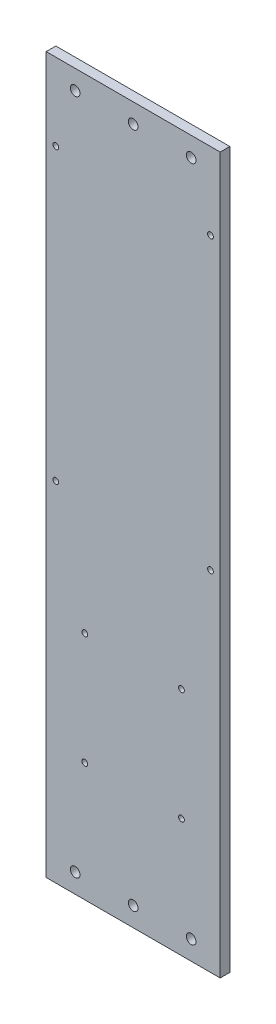
ISO-10303-21;
HEADER;
FILE_DESCRIPTION(('STEP AP214'),'2;1');
FILE_NAME('part.step','',(''),(''),'','','');
FILE_SCHEMA(('AUTOMOTIVE_DESIGN { 1 0 10303 214 1 1 1 1 }'));
ENDSEC;
DATA;
#1=APPLICATION_CONTEXT('core data for automotive mechanical design processes');
#2=APPLICATION_PROTOCOL_DEFINITION('international standard','automotive_design',2000,#1);
#3=PRODUCT_CONTEXT('',#1,'mechanical');
#4=PRODUCT('Part','Part','',(#3));
#5=PRODUCT_RELATED_PRODUCT_CATEGORY('part','',(#4));
#6=PRODUCT_DEFINITION_FORMATION('','',#4);
#7=PRODUCT_DEFINITION_CONTEXT('part definition',#1,'design');
#8=PRODUCT_DEFINITION('design','',#6,#7);
#9=PRODUCT_DEFINITION_SHAPE('','',#8);
#10=(LENGTH_UNIT() NAMED_UNIT(*) SI_UNIT(.MILLI.,.METRE.));
#11=(NAMED_UNIT(*) PLANE_ANGLE_UNIT() SI_UNIT($,.RADIAN.));
#12=(NAMED_UNIT(*) SI_UNIT($,.STERADIAN.) SOLID_ANGLE_UNIT());
#13=UNCERTAINTY_MEASURE_WITH_UNIT(LENGTH_MEASURE(1.E-05),#10,'distance_accuracy_value','');
#14=(GEOMETRIC_REPRESENTATION_CONTEXT(3) GLOBAL_UNCERTAINTY_ASSIGNED_CONTEXT((#13)) GLOBAL_UNIT_ASSIGNED_CONTEXT((#10,
#11,#12)) REPRESENTATION_CONTEXT('',''));
#15=CARTESIAN_POINT('',(0.,0.,0.));
#16=DIRECTION('',(0.,0.,1.));
#17=DIRECTION('',(1.,0.,0.));
#18=AXIS2_PLACEMENT_3D('',#15,#16,#17);
#19=CARTESIAN_POINT('',(-45.,-185.,2.5));
#20=DIRECTION('',(1.,0.,0.));
#21=DIRECTION('',(0.,0.,-1.));
#22=AXIS2_PLACEMENT_3D('',#19,#20,#21);
#23=PLANE('',#22);
#24=DIRECTION('',(0.,-1.,0.));
#25=VECTOR('',#24,1.);
#26=CARTESIAN_POINT('',(-45.,-185.,-2.5));
#27=LINE('',#26,#25);
#28=CARTESIAN_POINT('',(-45.,185.,-2.5));
#29=VERTEX_POINT('',#28);
#30=CARTESIAN_POINT('',(-45.,-185.,-2.5));
#31=VERTEX_POINT('',#30);
#32=EDGE_CURVE('E111',#29,#31,#27,.T.);
#33=ORIENTED_EDGE('',*,*,#32,.T.);
#34=DIRECTION('',(0.,0.,-1.));
#35=VECTOR('',#34,1.);
#36=CARTESIAN_POINT('',(-45.,-185.,2.5));
#37=LINE('',#36,#35);
#38=CARTESIAN_POINT('',(-45.,-185.,2.5));
#39=VERTEX_POINT('',#38);
#40=EDGE_CURVE('E11',#39,#31,#37,.T.);
#41=ORIENTED_EDGE('',*,*,#40,.F.);
#42=DIRECTION('',(0.,-1.,0.));
#43=VECTOR('',#42,1.);
#44=CARTESIAN_POINT('',(-45.,-185.,2.5));
#45=LINE('',#44,#43);
#46=CARTESIAN_POINT('',(-45.,185.,2.5));
#47=VERTEX_POINT('',#46);
#48=EDGE_CURVE('E95',#47,#39,#45,.T.);
#49=ORIENTED_EDGE('',*,*,#48,.F.);
#50=DIRECTION('',(0.,0.,-1.));
#51=VECTOR('',#50,1.);
#52=CARTESIAN_POINT('',(-45.,185.,2.5));
#53=LINE('',#52,#51);
#54=EDGE_CURVE('E107',#47,#29,#53,.T.);
#55=ORIENTED_EDGE('',*,*,#54,.T.);
#56=EDGE_LOOP('',(#33,#41,#49,#55));
#57=FACE_BOUND('',#56,.T.);
#58=ADVANCED_FACE('F43',(#57),#23,.F.);
#59=CARTESIAN_POINT('',(45.,-185.,2.5));
#60=DIRECTION('',(0.,1.,0.));
#61=DIRECTION('',(0.,0.,1.));
#62=AXIS2_PLACEMENT_3D('',#59,#60,#61);
#63=PLANE('',#62);
#64=DIRECTION('',(1.,0.,0.));
#65=VECTOR('',#64,1.);
#66=CARTESIAN_POINT('',(45.,-185.,-2.5));
#67=LINE('',#66,#65);
#68=CARTESIAN_POINT('',(45.,-185.,-2.5));
#69=VERTEX_POINT('',#68);
#70=EDGE_CURVE('E100',#31,#69,#67,.T.);
#71=ORIENTED_EDGE('',*,*,#70,.T.);
#72=DIRECTION('',(0.,0.,-1.));
#73=VECTOR('',#72,1.);
#74=CARTESIAN_POINT('',(45.,-185.,2.5));
#75=LINE('',#74,#73);
#76=CARTESIAN_POINT('',(45.,-185.,2.5));
#77=VERTEX_POINT('',#76);
#78=EDGE_CURVE('E52',#77,#69,#75,.T.);
#79=ORIENTED_EDGE('',*,*,#78,.F.);
#80=DIRECTION('',(1.,0.,0.));
#81=VECTOR('',#80,1.);
#82=CARTESIAN_POINT('',(45.,-185.,2.5));
#83=LINE('',#82,#81);
#84=EDGE_CURVE('E90',#39,#77,#83,.T.);
#85=ORIENTED_EDGE('',*,*,#84,.F.);
#86=ORIENTED_EDGE('',*,*,#40,.T.);
#87=EDGE_LOOP('',(#71,#79,#85,#86));
#88=FACE_BOUND('',#87,.T.);
#89=ADVANCED_FACE('F99',(#88),#63,.F.);
#90=CARTESIAN_POINT('',(45.,-185.,2.5));
#91=DIRECTION('',(-1.,0.,0.));
#92=DIRECTION('',(0.,0.,1.));
#93=AXIS2_PLACEMENT_3D('',#90,#91,#92);
#94=PLANE('',#93);
#95=DIRECTION('',(0.,1.,0.));
#96=VECTOR('',#95,1.);
#97=CARTESIAN_POINT('',(45.,-185.,-2.5));
#98=LINE('',#97,#96);
#99=CARTESIAN_POINT('',(45.,185.,-2.5));
#100=VERTEX_POINT('',#99);
#101=EDGE_CURVE('E77',#69,#100,#98,.T.);
#102=ORIENTED_EDGE('',*,*,#101,.T.);
#103=DIRECTION('',(0.,0.,-1.));
#104=VECTOR('',#103,1.);
#105=CARTESIAN_POINT('',(45.,185.,2.5));
#106=LINE('',#105,#104);
#107=CARTESIAN_POINT('',(45.,185.,2.5));
#108=VERTEX_POINT('',#107);
#109=EDGE_CURVE('E102',#108,#100,#106,.T.);
#110=ORIENTED_EDGE('',*,*,#109,.F.);
#111=DIRECTION('',(0.,1.,0.));
#112=VECTOR('',#111,1.);
#113=CARTESIAN_POINT('',(45.,-185.,2.5));
#114=LINE('',#113,#112);
#115=EDGE_CURVE('E93',#77,#108,#114,.T.);
#116=ORIENTED_EDGE('',*,*,#115,.F.);
#117=ORIENTED_EDGE('',*,*,#78,.T.);
#118=EDGE_LOOP('',(#102,#110,#116,#117));
#119=FACE_BOUND('',#118,.T.);
#120=ADVANCED_FACE('F103',(#119),#94,.F.);
#121=CARTESIAN_POINT('',(45.,185.,2.5));
#122=DIRECTION('',(0.,-1.,0.));
#123=DIRECTION('',(0.,0.,-1.));
#124=AXIS2_PLACEMENT_3D('',#121,#122,#123);
#125=PLANE('',#124);
#126=DIRECTION('',(-1.,0.,0.));
#127=VECTOR('',#126,1.);
#128=CARTESIAN_POINT('',(45.,185.,-2.5));
#129=LINE('',#128,#127);
#130=EDGE_CURVE('E83',#100,#29,#129,.T.);
#131=ORIENTED_EDGE('',*,*,#130,.T.);
#132=ORIENTED_EDGE('',*,*,#54,.F.);
#133=DIRECTION('',(-1.,0.,0.));
#134=VECTOR('',#133,1.);
#135=CARTESIAN_POINT('',(45.,185.,2.5));
#136=LINE('',#135,#134);
#137=EDGE_CURVE('E60',#108,#47,#136,.T.);
#138=ORIENTED_EDGE('',*,*,#137,.F.);
#139=ORIENTED_EDGE('',*,*,#109,.T.);
#140=EDGE_LOOP('',(#131,#132,#138,#139));
#141=FACE_BOUND('',#140,.T.);
#142=ADVANCED_FACE('F125',(#141),#125,.F.);
#143=CARTESIAN_POINT('',(0.,0.,2.5));
#144=DIRECTION('',(0.,0.,1.));
#145=DIRECTION('',(1.,0.,0.));
#146=AXIS2_PLACEMENT_3D('',#143,#144,#145);
#147=PLANE('',#146);
#148=CARTESIAN_POINT('',(-25.,-123.576005542389,2.5));
#149=DIRECTION('',(0.,0.,1.));
#150=DIRECTION('',(-1.,0.,0.));
#151=AXIS2_PLACEMENT_3D('',#148,#149,#150);
#152=CIRCLE('',#151,1.5);
#153=CARTESIAN_POINT('',(-26.5,-123.576005542389,2.5));
#154=VERTEX_POINT('',#153);
#155=EDGE_CURVE('E216',#154,#154,#152,.T.);
#156=ORIENTED_EDGE('',*,*,#155,.F.);
#157=EDGE_LOOP('',(#156));
#158=FACE_BOUND('',#157,.T.);
#159=CARTESIAN_POINT('',(25.,-65.576005542389,2.5));
#160=DIRECTION('',(0.,0.,1.));
#161=DIRECTION('',(-1.,0.,0.));
#162=AXIS2_PLACEMENT_3D('',#159,#160,#161);
#163=CIRCLE('',#162,1.5);
#164=CARTESIAN_POINT('',(23.5,-65.576005542389,2.5));
#165=VERTEX_POINT('',#164);
#166=EDGE_CURVE('E224',#165,#165,#163,.T.);
#167=ORIENTED_EDGE('',*,*,#166,.F.);
#168=EDGE_LOOP('',(#167));
#169=FACE_BOUND('',#168,.T.);
#170=CARTESIAN_POINT('',(-25.,-65.576005542389,2.5));
#171=DIRECTION('',(0.,0.,1.));
#172=DIRECTION('',(1.,0.,0.));
#173=AXIS2_PLACEMENT_3D('',#170,#171,#172);
#174=CIRCLE('',#173,1.5);
#175=CARTESIAN_POINT('',(-23.5,-65.576005542389,2.5));
#176=VERTEX_POINT('',#175);
#177=EDGE_CURVE('E225',#176,#176,#174,.T.);
#178=ORIENTED_EDGE('',*,*,#177,.F.);
#179=EDGE_LOOP('',(#178));
#180=FACE_BOUND('',#179,.T.);
#181=CARTESIAN_POINT('',(25.,-123.576005542389,2.5));
#182=DIRECTION('',(0.,0.,1.));
#183=DIRECTION('',(1.,0.,0.));
#184=AXIS2_PLACEMENT_3D('',#181,#182,#183);
#185=CIRCLE('',#184,1.5);
#186=CARTESIAN_POINT('',(26.5,-123.576005542389,2.5));
#187=VERTEX_POINT('',#186);
#188=EDGE_CURVE('E212',#187,#187,#185,.T.);
#189=ORIENTED_EDGE('',*,*,#188,.F.);
#190=EDGE_LOOP('',(#189));
#191=FACE_BOUND('',#190,.T.);
#192=CARTESIAN_POINT('',(40.,-4.82719780708021,2.5));
#193=DIRECTION('',(0.,0.,1.));
#194=DIRECTION('',(-1.,0.,0.));
#195=AXIS2_PLACEMENT_3D('',#192,#193,#194);
#196=CIRCLE('',#195,1.5);
#197=CARTESIAN_POINT('',(38.5,-4.82719780708021,2.5));
#198=VERTEX_POINT('',#197);
#199=EDGE_CURVE('E192',#198,#198,#196,.T.);
#200=ORIENTED_EDGE('',*,*,#199,.F.);
#201=EDGE_LOOP('',(#200));
#202=FACE_BOUND('',#201,.T.);
#203=CARTESIAN_POINT('',(-40.,-4.82719780708021,2.5));
#204=DIRECTION('',(0.,0.,1.));
#205=DIRECTION('',(1.,0.,0.));
#206=AXIS2_PLACEMENT_3D('',#203,#204,#205);
#207=CIRCLE('',#206,1.5);
#208=CARTESIAN_POINT('',(-38.5,-4.82719780708021,2.5));
#209=VERTEX_POINT('',#208);
#210=EDGE_CURVE('E201',#209,#209,#207,.T.);
#211=ORIENTED_EDGE('',*,*,#210,.F.);
#212=EDGE_LOOP('',(#211));
#213=FACE_BOUND('',#212,.T.);
#214=CARTESIAN_POINT('',(-40.,145.17280219292,2.5));
#215=DIRECTION('',(0.,0.,1.));
#216=DIRECTION('',(-1.,0.,0.));
#217=AXIS2_PLACEMENT_3D('',#214,#215,#216);
#218=CIRCLE('',#217,1.5);
#219=CARTESIAN_POINT('',(-41.5,145.17280219292,2.5));
#220=VERTEX_POINT('',#219);
#221=EDGE_CURVE('E184',#220,#220,#218,.T.);
#222=ORIENTED_EDGE('',*,*,#221,.F.);
#223=EDGE_LOOP('',(#222));
#224=FACE_BOUND('',#223,.T.);
#225=CARTESIAN_POINT('',(40.,145.17280219292,2.5));
#226=DIRECTION('',(0.,0.,1.));
#227=DIRECTION('',(1.,0.,0.));
#228=AXIS2_PLACEMENT_3D('',#225,#226,#227);
#229=CIRCLE('',#228,1.5);
#230=CARTESIAN_POINT('',(41.5,145.17280219292,2.5));
#231=VERTEX_POINT('',#230);
#232=EDGE_CURVE('E180',#231,#231,#229,.T.);
#233=ORIENTED_EDGE('',*,*,#232,.F.);
#234=EDGE_LOOP('',(#233));
#235=FACE_BOUND('',#234,.T.);
#236=CARTESIAN_POINT('',(30.,175.,2.5));
#237=DIRECTION('',(0.,0.,1.));
#238=DIRECTION('',(1.,0.,0.));
#239=AXIS2_PLACEMENT_3D('',#236,#237,#238);
#240=CIRCLE('',#239,2.5);
#241=CARTESIAN_POINT('',(32.5,175.,2.5));
#242=VERTEX_POINT('',#241);
#243=EDGE_CURVE('E136',#242,#242,#240,.T.);
#244=ORIENTED_EDGE('',*,*,#243,.F.);
#245=EDGE_LOOP('',(#244));
#246=FACE_BOUND('',#245,.T.);
#247=CARTESIAN_POINT('',(-30.,175.,2.5));
#248=DIRECTION('',(0.,0.,1.));
#249=DIRECTION('',(1.,0.,0.));
#250=AXIS2_PLACEMENT_3D('',#247,#248,#249);
#251=CIRCLE('',#250,2.5);
#252=CARTESIAN_POINT('',(-27.5,175.,2.5));
#253=VERTEX_POINT('',#252);
#254=EDGE_CURVE('E161',#253,#253,#251,.T.);
#255=ORIENTED_EDGE('',*,*,#254,.F.);
#256=EDGE_LOOP('',(#255));
#257=FACE_BOUND('',#256,.T.);
#258=CARTESIAN_POINT('',(-29.9999999999974,-175.000000000001,2.5));
#259=DIRECTION('',(0.,0.,1.));
#260=DIRECTION('',(-1.,0.,0.));
#261=AXIS2_PLACEMENT_3D('',#258,#259,#260);
#262=CIRCLE('',#261,2.5);
#263=CARTESIAN_POINT('',(-32.4999999999974,-175.000000000001,2.5));
#264=VERTEX_POINT('',#263);
#265=EDGE_CURVE('E153',#264,#264,#262,.T.);
#266=ORIENTED_EDGE('',*,*,#265,.F.);
#267=EDGE_LOOP('',(#266));
#268=FACE_BOUND('',#267,.T.);
#269=CARTESIAN_POINT('',(30.0000000000026,-175.,2.5));
#270=DIRECTION('',(0.,0.,1.));
#271=DIRECTION('',(-1.,0.,0.));
#272=AXIS2_PLACEMENT_3D('',#269,#270,#271);
#273=CIRCLE('',#272,2.49999999999999);
#274=CARTESIAN_POINT('',(27.5000000000026,-175.,2.5));
#275=VERTEX_POINT('',#274);
#276=EDGE_CURVE('E144',#275,#275,#273,.T.);
#277=ORIENTED_EDGE('',*,*,#276,.F.);
#278=EDGE_LOOP('',(#277));
#279=FACE_BOUND('',#278,.T.);
#280=CARTESIAN_POINT('',(2.59174503759118E-12,-175.,2.5));
#281=DIRECTION('',(0.,0.,1.));
#282=DIRECTION('',(-1.,0.,0.));
#283=AXIS2_PLACEMENT_3D('',#280,#281,#282);
#284=CIRCLE('',#283,2.49999999999999);
#285=CARTESIAN_POINT('',(-2.4999999999974,-175.,2.5));
#286=VERTEX_POINT('',#285);
#287=EDGE_CURVE('E145',#286,#286,#284,.T.);
#288=ORIENTED_EDGE('',*,*,#287,.F.);
#289=EDGE_LOOP('',(#288));
#290=FACE_BOUND('',#289,.T.);
#291=CARTESIAN_POINT('',(0.,175.,2.5));
#292=DIRECTION('',(0.,0.,1.));
#293=DIRECTION('',(1.,0.,0.));
#294=AXIS2_PLACEMENT_3D('',#291,#292,#293);
#295=CIRCLE('',#294,2.5);
#296=CARTESIAN_POINT('',(2.5,175.,2.5));
#297=VERTEX_POINT('',#296);
#298=EDGE_CURVE('E132',#297,#297,#295,.T.);
#299=ORIENTED_EDGE('',*,*,#298,.F.);
#300=EDGE_LOOP('',(#299));
#301=FACE_BOUND('',#300,.T.);
#302=ORIENTED_EDGE('',*,*,#48,.T.);
#303=ORIENTED_EDGE('',*,*,#84,.T.);
#304=ORIENTED_EDGE('',*,*,#115,.T.);
#305=ORIENTED_EDGE('',*,*,#137,.T.);
#306=EDGE_LOOP('',(#302,#303,#304,#305));
#307=FACE_BOUND('',#306,.T.);
#308=ADVANCED_FACE('F91',(#158,#169,#180,#191,#202,#213,#224,#235,#246,#257,#268,#279,#290,#301,
#307),#147,.T.);
#309=CARTESIAN_POINT('',(0.,0.,-2.5));
#310=DIRECTION('',(0.,0.,1.));
#311=DIRECTION('',(1.,0.,0.));
#312=AXIS2_PLACEMENT_3D('',#309,#310,#311);
#313=PLANE('',#312);
#314=CARTESIAN_POINT('',(-25.,-123.576005542389,-2.5));
#315=DIRECTION('',(0.,0.,1.));
#316=DIRECTION('',(-1.,0.,0.));
#317=AXIS2_PLACEMENT_3D('',#314,#315,#316);
#318=CIRCLE('',#317,1.5);
#319=CARTESIAN_POINT('',(-26.5,-123.576005542389,-2.5));
#320=VERTEX_POINT('',#319);
#321=EDGE_CURVE('E229',#320,#320,#318,.T.);
#322=ORIENTED_EDGE('',*,*,#321,.T.);
#323=EDGE_LOOP('',(#322));
#324=FACE_BOUND('',#323,.T.);
#325=CARTESIAN_POINT('',(25.,-65.576005542389,-2.5));
#326=DIRECTION('',(0.,0.,1.));
#327=DIRECTION('',(-1.,0.,0.));
#328=AXIS2_PLACEMENT_3D('',#325,#326,#327);
#329=CIRCLE('',#328,1.5);
#330=CARTESIAN_POINT('',(23.5,-65.576005542389,-2.5));
#331=VERTEX_POINT('',#330);
#332=EDGE_CURVE('E220',#331,#331,#329,.T.);
#333=ORIENTED_EDGE('',*,*,#332,.T.);
#334=EDGE_LOOP('',(#333));
#335=FACE_BOUND('',#334,.T.);
#336=CARTESIAN_POINT('',(-25.,-65.576005542389,-2.5));
#337=DIRECTION('',(0.,0.,1.));
#338=DIRECTION('',(1.,0.,0.));
#339=AXIS2_PLACEMENT_3D('',#336,#337,#338);
#340=CIRCLE('',#339,1.5);
#341=CARTESIAN_POINT('',(-23.5,-65.576005542389,-2.5));
#342=VERTEX_POINT('',#341);
#343=EDGE_CURVE('E236',#342,#342,#340,.T.);
#344=ORIENTED_EDGE('',*,*,#343,.T.);
#345=EDGE_LOOP('',(#344));
#346=FACE_BOUND('',#345,.T.);
#347=CARTESIAN_POINT('',(25.,-123.576005542389,-2.5));
#348=DIRECTION('',(0.,0.,1.));
#349=DIRECTION('',(1.,0.,0.));
#350=AXIS2_PLACEMENT_3D('',#347,#348,#349);
#351=CIRCLE('',#350,1.5);
#352=CARTESIAN_POINT('',(26.5,-123.576005542389,-2.5));
#353=VERTEX_POINT('',#352);
#354=EDGE_CURVE('E193',#353,#353,#351,.T.);
#355=ORIENTED_EDGE('',*,*,#354,.T.);
#356=EDGE_LOOP('',(#355));
#357=FACE_BOUND('',#356,.T.);
#358=CARTESIAN_POINT('',(40.,-4.82719780708021,-2.5));
#359=DIRECTION('',(0.,0.,1.));
#360=DIRECTION('',(-1.,0.,0.));
#361=AXIS2_PLACEMENT_3D('',#358,#359,#360);
#362=CIRCLE('',#361,1.5);
#363=CARTESIAN_POINT('',(38.5,-4.82719780708021,-2.5));
#364=VERTEX_POINT('',#363);
#365=EDGE_CURVE('E188',#364,#364,#362,.T.);
#366=ORIENTED_EDGE('',*,*,#365,.T.);
#367=EDGE_LOOP('',(#366));
#368=FACE_BOUND('',#367,.T.);
#369=CARTESIAN_POINT('',(-40.,-4.82719780708021,-2.5));
#370=DIRECTION('',(0.,0.,1.));
#371=DIRECTION('',(1.,0.,0.));
#372=AXIS2_PLACEMENT_3D('',#369,#370,#371);
#373=CIRCLE('',#372,1.5);
#374=CARTESIAN_POINT('',(-38.5,-4.82719780708021,-2.5));
#375=VERTEX_POINT('',#374);
#376=EDGE_CURVE('E197',#375,#375,#373,.T.);
#377=ORIENTED_EDGE('',*,*,#376,.T.);
#378=EDGE_LOOP('',(#377));
#379=FACE_BOUND('',#378,.T.);
#380=CARTESIAN_POINT('',(-40.,145.17280219292,-2.5));
#381=DIRECTION('',(0.,0.,1.));
#382=DIRECTION('',(-1.,0.,0.));
#383=AXIS2_PLACEMENT_3D('',#380,#381,#382);
#384=CIRCLE('',#383,1.5);
#385=CARTESIAN_POINT('',(-41.5,145.17280219292,-2.5));
#386=VERTEX_POINT('',#385);
#387=EDGE_CURVE('E205',#386,#386,#384,.T.);
#388=ORIENTED_EDGE('',*,*,#387,.T.);
#389=EDGE_LOOP('',(#388));
#390=FACE_BOUND('',#389,.T.);
#391=CARTESIAN_POINT('',(40.,145.17280219292,-2.5));
#392=DIRECTION('',(0.,0.,1.));
#393=DIRECTION('',(1.,0.,0.));
#394=AXIS2_PLACEMENT_3D('',#391,#392,#393);
#395=CIRCLE('',#394,1.5);
#396=CARTESIAN_POINT('',(41.5,145.17280219292,-2.5));
#397=VERTEX_POINT('',#396);
#398=EDGE_CURVE('E176',#397,#397,#395,.T.);
#399=ORIENTED_EDGE('',*,*,#398,.T.);
#400=EDGE_LOOP('',(#399));
#401=FACE_BOUND('',#400,.T.);
#402=CARTESIAN_POINT('',(30.,175.,-2.5));
#403=DIRECTION('',(0.,0.,1.));
#404=DIRECTION('',(1.,0.,0.));
#405=AXIS2_PLACEMENT_3D('',#402,#403,#404);
#406=CIRCLE('',#405,2.5);
#407=CARTESIAN_POINT('',(32.5,175.,-2.5));
#408=VERTEX_POINT('',#407);
#409=EDGE_CURVE('E165',#408,#408,#406,.T.);
#410=ORIENTED_EDGE('',*,*,#409,.T.);
#411=EDGE_LOOP('',(#410));
#412=FACE_BOUND('',#411,.T.);
#413=CARTESIAN_POINT('',(-30.,175.,-2.5));
#414=DIRECTION('',(0.,0.,1.));
#415=DIRECTION('',(1.,0.,0.));
#416=AXIS2_PLACEMENT_3D('',#413,#414,#415);
#417=CIRCLE('',#416,2.5);
#418=CARTESIAN_POINT('',(-27.5,175.,-2.5));
#419=VERTEX_POINT('',#418);
#420=EDGE_CURVE('E157',#419,#419,#417,.T.);
#421=ORIENTED_EDGE('',*,*,#420,.T.);
#422=EDGE_LOOP('',(#421));
#423=FACE_BOUND('',#422,.T.);
#424=CARTESIAN_POINT('',(-29.9999999999974,-175.000000000001,-2.5));
#425=DIRECTION('',(0.,0.,1.));
#426=DIRECTION('',(-1.,0.,0.));
#427=AXIS2_PLACEMENT_3D('',#424,#425,#426);
#428=CIRCLE('',#427,2.5);
#429=CARTESIAN_POINT('',(-32.4999999999974,-175.000000000001,-2.5));
#430=VERTEX_POINT('',#429);
#431=EDGE_CURVE('E149',#430,#430,#428,.T.);
#432=ORIENTED_EDGE('',*,*,#431,.T.);
#433=EDGE_LOOP('',(#432));
#434=FACE_BOUND('',#433,.T.);
#435=CARTESIAN_POINT('',(30.0000000000026,-175.,-2.5));
#436=DIRECTION('',(0.,0.,1.));
#437=DIRECTION('',(-1.,0.,0.));
#438=AXIS2_PLACEMENT_3D('',#435,#436,#437);
#439=CIRCLE('',#438,2.49999999999999);
#440=CARTESIAN_POINT('',(27.5000000000026,-175.,-2.5));
#441=VERTEX_POINT('',#440);
#442=EDGE_CURVE('E140',#441,#441,#439,.T.);
#443=ORIENTED_EDGE('',*,*,#442,.T.);
#444=EDGE_LOOP('',(#443));
#445=FACE_BOUND('',#444,.T.);
#446=CARTESIAN_POINT('',(2.59174503759118E-12,-175.,-2.5));
#447=DIRECTION('',(0.,0.,1.));
#448=DIRECTION('',(-1.,0.,0.));
#449=AXIS2_PLACEMENT_3D('',#446,#447,#448);
#450=CIRCLE('',#449,2.49999999999999);
#451=CARTESIAN_POINT('',(-2.4999999999974,-175.,-2.5));
#452=VERTEX_POINT('',#451);
#453=EDGE_CURVE('E172',#452,#452,#450,.T.);
#454=ORIENTED_EDGE('',*,*,#453,.T.);
#455=EDGE_LOOP('',(#454));
#456=FACE_BOUND('',#455,.T.);
#457=CARTESIAN_POINT('',(0.,175.,-2.5));
#458=DIRECTION('',(0.,0.,1.));
#459=DIRECTION('',(1.,0.,0.));
#460=AXIS2_PLACEMENT_3D('',#457,#458,#459);
#461=CIRCLE('',#460,2.5);
#462=CARTESIAN_POINT('',(2.5,175.,-2.5));
#463=VERTEX_POINT('',#462);
#464=EDGE_CURVE('E115',#463,#463,#461,.T.);
#465=ORIENTED_EDGE('',*,*,#464,.T.);
#466=EDGE_LOOP('',(#465));
#467=FACE_BOUND('',#466,.T.);
#468=ORIENTED_EDGE('',*,*,#32,.F.);
#469=ORIENTED_EDGE('',*,*,#130,.F.);
#470=ORIENTED_EDGE('',*,*,#101,.F.);
#471=ORIENTED_EDGE('',*,*,#70,.F.);
#472=EDGE_LOOP('',(#468,#469,#470,#471));
#473=FACE_BOUND('',#472,.T.);
#474=ADVANCED_FACE('F128',(#324,#335,#346,#357,#368,#379,#390,#401,#412,#423,#434,#445,#456,
#467,#473),#313,.F.);
#475=CARTESIAN_POINT('',(0.,175.,-2.5));
#476=DIRECTION('',(0.,0.,1.));
#477=DIRECTION('',(1.,0.,0.));
#478=AXIS2_PLACEMENT_3D('',#475,#476,#477);
#479=CYLINDRICAL_SURFACE('',#478,2.5);
#480=ORIENTED_EDGE('',*,*,#464,.F.);
#481=EDGE_LOOP('',(#480));
#482=FACE_BOUND('',#481,.T.);
#483=ORIENTED_EDGE('',*,*,#298,.T.);
#484=EDGE_LOOP('',(#483));
#485=FACE_BOUND('',#484,.T.);
#486=ADVANCED_FACE('F272',(#482,#485),#479,.F.);
#487=CARTESIAN_POINT('',(2.59174503759118E-12,-175.,-2.5));
#488=DIRECTION('',(0.,0.,1.));
#489=DIRECTION('',(1.,0.,0.));
#490=AXIS2_PLACEMENT_3D('',#487,#488,#489);
#491=CYLINDRICAL_SURFACE('',#490,2.49999999999999);
#492=ORIENTED_EDGE('',*,*,#453,.F.);
#493=EDGE_LOOP('',(#492));
#494=FACE_BOUND('',#493,.T.);
#495=ORIENTED_EDGE('',*,*,#287,.T.);
#496=EDGE_LOOP('',(#495));
#497=FACE_BOUND('',#496,.T.);
#498=ADVANCED_FACE('F274',(#494,#497),#491,.F.);
#499=CARTESIAN_POINT('',(30.0000000000026,-175.,-2.5));
#500=DIRECTION('',(0.,0.,1.));
#501=DIRECTION('',(1.,0.,0.));
#502=AXIS2_PLACEMENT_3D('',#499,#500,#501);
#503=CYLINDRICAL_SURFACE('',#502,2.49999999999999);
#504=ORIENTED_EDGE('',*,*,#442,.F.);
#505=EDGE_LOOP('',(#504));
#506=FACE_BOUND('',#505,.T.);
#507=ORIENTED_EDGE('',*,*,#276,.T.);
#508=EDGE_LOOP('',(#507));
#509=FACE_BOUND('',#508,.T.);
#510=ADVANCED_FACE('F281',(#506,#509),#503,.F.);
#511=CARTESIAN_POINT('',(-29.9999999999974,-175.000000000001,-2.5));
#512=DIRECTION('',(0.,0.,1.));
#513=DIRECTION('',(1.,0.,0.));
#514=AXIS2_PLACEMENT_3D('',#511,#512,#513);
#515=CYLINDRICAL_SURFACE('',#514,2.5);
#516=ORIENTED_EDGE('',*,*,#431,.F.);
#517=EDGE_LOOP('',(#516));
#518=FACE_BOUND('',#517,.T.);
#519=ORIENTED_EDGE('',*,*,#265,.T.);
#520=EDGE_LOOP('',(#519));
#521=FACE_BOUND('',#520,.T.);
#522=ADVANCED_FACE('F419',(#518,#521),#515,.F.);
#523=CARTESIAN_POINT('',(-30.,175.,-2.5));
#524=DIRECTION('',(0.,0.,1.));
#525=DIRECTION('',(1.,0.,0.));
#526=AXIS2_PLACEMENT_3D('',#523,#524,#525);
#527=CYLINDRICAL_SURFACE('',#526,2.5);
#528=ORIENTED_EDGE('',*,*,#420,.F.);
#529=EDGE_LOOP('',(#528));
#530=FACE_BOUND('',#529,.T.);
#531=ORIENTED_EDGE('',*,*,#254,.T.);
#532=EDGE_LOOP('',(#531));
#533=FACE_BOUND('',#532,.T.);
#534=ADVANCED_FACE('F409',(#530,#533),#527,.F.);
#535=CARTESIAN_POINT('',(30.,175.,-2.5));
#536=DIRECTION('',(0.,0.,1.));
#537=DIRECTION('',(1.,0.,0.));
#538=AXIS2_PLACEMENT_3D('',#535,#536,#537);
#539=CYLINDRICAL_SURFACE('',#538,2.5);
#540=ORIENTED_EDGE('',*,*,#409,.F.);
#541=EDGE_LOOP('',(#540));
#542=FACE_BOUND('',#541,.T.);
#543=ORIENTED_EDGE('',*,*,#243,.T.);
#544=EDGE_LOOP('',(#543));
#545=FACE_BOUND('',#544,.T.);
#546=ADVANCED_FACE('F399',(#542,#545),#539,.F.);
#547=CARTESIAN_POINT('',(40.,145.17280219292,-2.5));
#548=DIRECTION('',(0.,0.,1.));
#549=DIRECTION('',(1.,0.,0.));
#550=AXIS2_PLACEMENT_3D('',#547,#548,#549);
#551=CYLINDRICAL_SURFACE('',#550,1.5);
#552=ORIENTED_EDGE('',*,*,#398,.F.);
#553=EDGE_LOOP('',(#552));
#554=FACE_BOUND('',#553,.T.);
#555=ORIENTED_EDGE('',*,*,#232,.T.);
#556=EDGE_LOOP('',(#555));
#557=FACE_BOUND('',#556,.T.);
#558=ADVANCED_FACE('F389',(#554,#557),#551,.F.);
#559=CARTESIAN_POINT('',(-40.,145.17280219292,-2.5));
#560=DIRECTION('',(0.,0.,1.));
#561=DIRECTION('',(1.,0.,0.));
#562=AXIS2_PLACEMENT_3D('',#559,#560,#561);
#563=CYLINDRICAL_SURFACE('',#562,1.5);
#564=ORIENTED_EDGE('',*,*,#387,.F.);
#565=EDGE_LOOP('',(#564));
#566=FACE_BOUND('',#565,.T.);
#567=ORIENTED_EDGE('',*,*,#221,.T.);
#568=EDGE_LOOP('',(#567));
#569=FACE_BOUND('',#568,.T.);
#570=ADVANCED_FACE('F379',(#566,#569),#563,.F.);
#571=CARTESIAN_POINT('',(-40.,-4.82719780708021,-2.5));
#572=DIRECTION('',(0.,0.,1.));
#573=DIRECTION('',(1.,0.,0.));
#574=AXIS2_PLACEMENT_3D('',#571,#572,#573);
#575=CYLINDRICAL_SURFACE('',#574,1.5);
#576=ORIENTED_EDGE('',*,*,#376,.F.);
#577=EDGE_LOOP('',(#576));
#578=FACE_BOUND('',#577,.T.);
#579=ORIENTED_EDGE('',*,*,#210,.T.);
#580=EDGE_LOOP('',(#579));
#581=FACE_BOUND('',#580,.T.);
#582=ADVANCED_FACE('F370',(#578,#581),#575,.F.);
#583=CARTESIAN_POINT('',(40.,-4.82719780708021,-2.5));
#584=DIRECTION('',(0.,0.,1.));
#585=DIRECTION('',(1.,0.,0.));
#586=AXIS2_PLACEMENT_3D('',#583,#584,#585);
#587=CYLINDRICAL_SURFACE('',#586,1.5);
#588=ORIENTED_EDGE('',*,*,#365,.F.);
#589=EDGE_LOOP('',(#588));
#590=FACE_BOUND('',#589,.T.);
#591=ORIENTED_EDGE('',*,*,#199,.T.);
#592=EDGE_LOOP('',(#591));
#593=FACE_BOUND('',#592,.T.);
#594=ADVANCED_FACE('F323',(#590,#593),#587,.F.);
#595=CARTESIAN_POINT('',(25.,-123.576005542389,-2.5));
#596=DIRECTION('',(0.,0.,1.));
#597=DIRECTION('',(1.,0.,0.));
#598=AXIS2_PLACEMENT_3D('',#595,#596,#597);
#599=CYLINDRICAL_SURFACE('',#598,1.5);
#600=ORIENTED_EDGE('',*,*,#354,.F.);
#601=EDGE_LOOP('',(#600));
#602=FACE_BOUND('',#601,.T.);
#603=ORIENTED_EDGE('',*,*,#188,.T.);
#604=EDGE_LOOP('',(#603));
#605=FACE_BOUND('',#604,.T.);
#606=ADVANCED_FACE('F318',(#602,#605),#599,.F.);
#607=CARTESIAN_POINT('',(-25.,-65.576005542389,-2.5));
#608=DIRECTION('',(0.,0.,1.));
#609=DIRECTION('',(1.,0.,0.));
#610=AXIS2_PLACEMENT_3D('',#607,#608,#609);
#611=CYLINDRICAL_SURFACE('',#610,1.5);
#612=ORIENTED_EDGE('',*,*,#343,.F.);
#613=EDGE_LOOP('',(#612));
#614=FACE_BOUND('',#613,.T.);
#615=ORIENTED_EDGE('',*,*,#177,.T.);
#616=EDGE_LOOP('',(#615));
#617=FACE_BOUND('',#616,.T.);
#618=ADVANCED_FACE('F244',(#614,#617),#611,.F.);
#619=CARTESIAN_POINT('',(25.,-65.576005542389,-2.5));
#620=DIRECTION('',(0.,0.,1.));
#621=DIRECTION('',(1.,0.,0.));
#622=AXIS2_PLACEMENT_3D('',#619,#620,#621);
#623=CYLINDRICAL_SURFACE('',#622,1.5);
#624=ORIENTED_EDGE('',*,*,#332,.F.);
#625=EDGE_LOOP('',(#624));
#626=FACE_BOUND('',#625,.T.);
#627=ORIENTED_EDGE('',*,*,#166,.T.);
#628=EDGE_LOOP('',(#627));
#629=FACE_BOUND('',#628,.T.);
#630=ADVANCED_FACE('F336',(#626,#629),#623,.F.);
#631=CARTESIAN_POINT('',(-25.,-123.576005542389,-2.5));
#632=DIRECTION('',(0.,0.,1.));
#633=DIRECTION('',(1.,0.,0.));
#634=AXIS2_PLACEMENT_3D('',#631,#632,#633);
#635=CYLINDRICAL_SURFACE('',#634,1.5);
#636=ORIENTED_EDGE('',*,*,#321,.F.);
#637=EDGE_LOOP('',(#636));
#638=FACE_BOUND('',#637,.T.);
#639=ORIENTED_EDGE('',*,*,#155,.T.);
#640=EDGE_LOOP('',(#639));
#641=FACE_BOUND('',#640,.T.);
#642=ADVANCED_FACE('F347',(#638,#641),#635,.F.);
#643=CLOSED_SHELL('',(#58,#89,#120,#142,#308,#474,#486,#498,#510,#522,#534,#546,#558,#570,#582,
#594,#606,#618,#630,#642));
#644=MANIFOLD_SOLID_BREP('B2',#643);
#645=ADVANCED_BREP_SHAPE_REPRESENTATION('',(#18,#644),#14);
#646=SHAPE_DEFINITION_REPRESENTATION(#9,#645);
ENDSEC;
END-ISO-10303-21;
